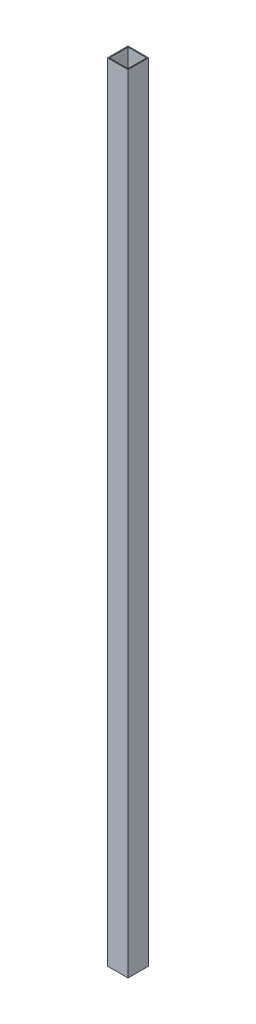
ISO-10303-21;
HEADER;
FILE_DESCRIPTION(('STEP AP214'),'2;1');
FILE_NAME('part.step','',(''),(''),'','','');
FILE_SCHEMA(('AUTOMOTIVE_DESIGN { 1 0 10303 214 1 1 1 1 }'));
ENDSEC;
DATA;
#1=APPLICATION_CONTEXT('core data for automotive mechanical design processes');
#2=APPLICATION_PROTOCOL_DEFINITION('international standard','automotive_design',2000,#1);
#3=PRODUCT_CONTEXT('',#1,'mechanical');
#4=PRODUCT('Part','Part','',(#3));
#5=PRODUCT_RELATED_PRODUCT_CATEGORY('part','',(#4));
#6=PRODUCT_DEFINITION_FORMATION('','',#4);
#7=PRODUCT_DEFINITION_CONTEXT('part definition',#1,'design');
#8=PRODUCT_DEFINITION('design','',#6,#7);
#9=PRODUCT_DEFINITION_SHAPE('','',#8);
#10=(LENGTH_UNIT() NAMED_UNIT(*) SI_UNIT(.MILLI.,.METRE.));
#11=(NAMED_UNIT(*) PLANE_ANGLE_UNIT() SI_UNIT($,.RADIAN.));
#12=(NAMED_UNIT(*) SI_UNIT($,.STERADIAN.) SOLID_ANGLE_UNIT());
#13=UNCERTAINTY_MEASURE_WITH_UNIT(LENGTH_MEASURE(1.E-05),#10,'distance_accuracy_value','');
#14=(GEOMETRIC_REPRESENTATION_CONTEXT(3) GLOBAL_UNCERTAINTY_ASSIGNED_CONTEXT((#13)) GLOBAL_UNIT_ASSIGNED_CONTEXT((#10,
#11,#12)) REPRESENTATION_CONTEXT('',''));
#15=CARTESIAN_POINT('',(0.,0.,0.));
#16=DIRECTION('',(0.,0.,1.));
#17=DIRECTION('',(1.,0.,0.));
#18=AXIS2_PLACEMENT_3D('',#15,#16,#17);
#19=CARTESIAN_POINT('',(0.,1923.,0.));
#20=DIRECTION('',(0.,-1.,0.));
#21=DIRECTION('',(0.,0.,-1.));
#22=AXIS2_PLACEMENT_3D('',#19,#20,#21);
#23=PLANE('',#22);
#24=DIRECTION('',(1.,0.,0.));
#25=VECTOR('',#24,1.);
#26=CARTESIAN_POINT('',(50.,1923.,0.));
#27=LINE('',#26,#25);
#28=CARTESIAN_POINT('',(0.,1923.,0.));
#29=VERTEX_POINT('',#28);
#30=CARTESIAN_POINT('',(50.,1923.,0.));
#31=VERTEX_POINT('',#30);
#32=EDGE_CURVE('E134',#29,#31,#27,.T.);
#33=ORIENTED_EDGE('',*,*,#32,.T.);
#34=DIRECTION('',(0.,0.,-1.));
#35=VECTOR('',#34,1.);
#36=CARTESIAN_POINT('',(50.,1923.,-50.));
#37=LINE('',#36,#35);
#38=CARTESIAN_POINT('',(50.,1923.,-50.));
#39=VERTEX_POINT('',#38);
#40=EDGE_CURVE('E137',#31,#39,#37,.T.);
#41=ORIENTED_EDGE('',*,*,#40,.T.);
#42=DIRECTION('',(-1.,0.,0.));
#43=VECTOR('',#42,1.);
#44=CARTESIAN_POINT('',(0.,1923.,-50.));
#45=LINE('',#44,#43);
#46=CARTESIAN_POINT('',(0.,1923.,-50.));
#47=VERTEX_POINT('',#46);
#48=EDGE_CURVE('E140',#39,#47,#45,.T.);
#49=ORIENTED_EDGE('',*,*,#48,.T.);
#50=DIRECTION('',(0.,0.,1.));
#51=VECTOR('',#50,1.);
#52=CARTESIAN_POINT('',(0.,1923.,0.));
#53=LINE('',#52,#51);
#54=EDGE_CURVE('E142',#47,#29,#53,.T.);
#55=ORIENTED_EDGE('',*,*,#54,.T.);
#56=EDGE_LOOP('',(#33,#41,#49,#55));
#57=FACE_BOUND('',#56,.T.);
#58=DIRECTION('',(0.,0.,1.));
#59=VECTOR('',#58,1.);
#60=CARTESIAN_POINT('',(2.2,1923.,-2.2));
#61=LINE('',#60,#59);
#62=CARTESIAN_POINT('',(2.2,1923.,-47.8));
#63=VERTEX_POINT('',#62);
#64=CARTESIAN_POINT('',(2.2,1923.,-2.2));
#65=VERTEX_POINT('',#64);
#66=EDGE_CURVE('E98',#63,#65,#61,.T.);
#67=ORIENTED_EDGE('',*,*,#66,.F.);
#68=DIRECTION('',(-1.,0.,0.));
#69=VECTOR('',#68,1.);
#70=CARTESIAN_POINT('',(2.2,1923.,-47.8));
#71=LINE('',#70,#69);
#72=CARTESIAN_POINT('',(47.8,1923.,-47.8));
#73=VERTEX_POINT('',#72);
#74=EDGE_CURVE('E120',#73,#63,#71,.T.);
#75=ORIENTED_EDGE('',*,*,#74,.F.);
#76=DIRECTION('',(0.,0.,-1.));
#77=VECTOR('',#76,1.);
#78=CARTESIAN_POINT('',(47.8,1923.,-47.8));
#79=LINE('',#78,#77);
#80=CARTESIAN_POINT('',(47.8,1923.,-2.2));
#81=VERTEX_POINT('',#80);
#82=EDGE_CURVE('E118',#81,#73,#79,.T.);
#83=ORIENTED_EDGE('',*,*,#82,.F.);
#84=DIRECTION('',(1.,0.,0.));
#85=VECTOR('',#84,1.);
#86=CARTESIAN_POINT('',(47.8,1923.,-2.2));
#87=LINE('',#86,#85);
#88=EDGE_CURVE('E106',#65,#81,#87,.T.);
#89=ORIENTED_EDGE('',*,*,#88,.F.);
#90=EDGE_LOOP('',(#67,#75,#83,#89));
#91=FACE_BOUND('',#90,.T.);
#92=ADVANCED_FACE('F33',(#57,#91),#23,.F.);
#93=CARTESIAN_POINT('',(0.,0.,0.));
#94=DIRECTION('',(0.,-1.,0.));
#95=DIRECTION('',(0.,0.,-1.));
#96=AXIS2_PLACEMENT_3D('',#93,#94,#95);
#97=PLANE('',#96);
#98=DIRECTION('',(1.,0.,0.));
#99=VECTOR('',#98,1.);
#100=CARTESIAN_POINT('',(50.,0.,0.));
#101=LINE('',#100,#99);
#102=CARTESIAN_POINT('',(0.,0.,0.));
#103=VERTEX_POINT('',#102);
#104=CARTESIAN_POINT('',(50.,0.,0.));
#105=VERTEX_POINT('',#104);
#106=EDGE_CURVE('E114',#103,#105,#101,.T.);
#107=ORIENTED_EDGE('',*,*,#106,.F.);
#108=DIRECTION('',(0.,0.,1.));
#109=VECTOR('',#108,1.);
#110=CARTESIAN_POINT('',(0.,0.,0.));
#111=LINE('',#110,#109);
#112=CARTESIAN_POINT('',(0.,0.,-50.));
#113=VERTEX_POINT('',#112);
#114=EDGE_CURVE('E138',#113,#103,#111,.T.);
#115=ORIENTED_EDGE('',*,*,#114,.F.);
#116=DIRECTION('',(-1.,0.,0.));
#117=VECTOR('',#116,1.);
#118=CARTESIAN_POINT('',(0.,0.,-50.));
#119=LINE('',#118,#117);
#120=CARTESIAN_POINT('',(50.,0.,-50.));
#121=VERTEX_POINT('',#120);
#122=EDGE_CURVE('E149',#121,#113,#119,.T.);
#123=ORIENTED_EDGE('',*,*,#122,.F.);
#124=DIRECTION('',(0.,0.,-1.));
#125=VECTOR('',#124,1.);
#126=CARTESIAN_POINT('',(50.,0.,-50.));
#127=LINE('',#126,#125);
#128=EDGE_CURVE('E147',#105,#121,#127,.T.);
#129=ORIENTED_EDGE('',*,*,#128,.F.);
#130=EDGE_LOOP('',(#107,#115,#123,#129));
#131=FACE_BOUND('',#130,.T.);
#132=DIRECTION('',(-1.,0.,0.));
#133=VECTOR('',#132,1.);
#134=CARTESIAN_POINT('',(2.2,0.,-47.8));
#135=LINE('',#134,#133);
#136=CARTESIAN_POINT('',(47.8,0.,-47.8));
#137=VERTEX_POINT('',#136);
#138=CARTESIAN_POINT('',(2.2,0.,-47.8));
#139=VERTEX_POINT('',#138);
#140=EDGE_CURVE('E107',#137,#139,#135,.T.);
#141=ORIENTED_EDGE('',*,*,#140,.T.);
#142=DIRECTION('',(0.,0.,1.));
#143=VECTOR('',#142,1.);
#144=CARTESIAN_POINT('',(2.2,0.,-2.2));
#145=LINE('',#144,#143);
#146=CARTESIAN_POINT('',(2.2,0.,-2.2));
#147=VERTEX_POINT('',#146);
#148=EDGE_CURVE('E56',#139,#147,#145,.T.);
#149=ORIENTED_EDGE('',*,*,#148,.T.);
#150=DIRECTION('',(1.,0.,0.));
#151=VECTOR('',#150,1.);
#152=CARTESIAN_POINT('',(47.8,0.,-2.2));
#153=LINE('',#152,#151);
#154=CARTESIAN_POINT('',(47.8,0.,-2.2));
#155=VERTEX_POINT('',#154);
#156=EDGE_CURVE('E113',#147,#155,#153,.T.);
#157=ORIENTED_EDGE('',*,*,#156,.T.);
#158=DIRECTION('',(0.,0.,-1.));
#159=VECTOR('',#158,1.);
#160=CARTESIAN_POINT('',(47.8,0.,-47.8));
#161=LINE('',#160,#159);
#162=EDGE_CURVE('E126',#155,#137,#161,.T.);
#163=ORIENTED_EDGE('',*,*,#162,.T.);
#164=EDGE_LOOP('',(#141,#149,#157,#163));
#165=FACE_BOUND('',#164,.T.);
#166=ADVANCED_FACE('F167',(#131,#165),#97,.T.);
#167=CARTESIAN_POINT('',(50.,1923.,0.));
#168=DIRECTION('',(0.,0.,-1.));
#169=DIRECTION('',(-1.,0.,0.));
#170=AXIS2_PLACEMENT_3D('',#167,#168,#169);
#171=PLANE('',#170);
#172=ORIENTED_EDGE('',*,*,#106,.T.);
#173=DIRECTION('',(0.,-1.,0.));
#174=VECTOR('',#173,1.);
#175=CARTESIAN_POINT('',(50.,1923.,0.));
#176=LINE('',#175,#174);
#177=EDGE_CURVE('E11',#31,#105,#176,.T.);
#178=ORIENTED_EDGE('',*,*,#177,.F.);
#179=ORIENTED_EDGE('',*,*,#32,.F.);
#180=DIRECTION('',(0.,-1.,0.));
#181=VECTOR('',#180,1.);
#182=CARTESIAN_POINT('',(0.,1923.,0.));
#183=LINE('',#182,#181);
#184=EDGE_CURVE('E144',#29,#103,#183,.T.);
#185=ORIENTED_EDGE('',*,*,#184,.T.);
#186=EDGE_LOOP('',(#172,#178,#179,#185));
#187=FACE_BOUND('',#186,.T.);
#188=ADVANCED_FACE('F35',(#187),#171,.F.);
#189=CARTESIAN_POINT('',(50.,1923.,-50.));
#190=DIRECTION('',(-1.,0.,0.));
#191=DIRECTION('',(0.,0.,1.));
#192=AXIS2_PLACEMENT_3D('',#189,#190,#191);
#193=PLANE('',#192);
#194=ORIENTED_EDGE('',*,*,#128,.T.);
#195=DIRECTION('',(0.,-1.,0.));
#196=VECTOR('',#195,1.);
#197=CARTESIAN_POINT('',(50.,1923.,-50.));
#198=LINE('',#197,#196);
#199=EDGE_CURVE('E41',#39,#121,#198,.T.);
#200=ORIENTED_EDGE('',*,*,#199,.F.);
#201=ORIENTED_EDGE('',*,*,#40,.F.);
#202=ORIENTED_EDGE('',*,*,#177,.T.);
#203=EDGE_LOOP('',(#194,#200,#201,#202));
#204=FACE_BOUND('',#203,.T.);
#205=ADVANCED_FACE('F177',(#204),#193,.F.);
#206=CARTESIAN_POINT('',(0.,1923.,-50.));
#207=DIRECTION('',(0.,0.,1.));
#208=DIRECTION('',(1.,0.,0.));
#209=AXIS2_PLACEMENT_3D('',#206,#207,#208);
#210=PLANE('',#209);
#211=ORIENTED_EDGE('',*,*,#122,.T.);
#212=DIRECTION('',(0.,-1.,0.));
#213=VECTOR('',#212,1.);
#214=CARTESIAN_POINT('',(0.,1923.,-50.));
#215=LINE('',#214,#213);
#216=EDGE_CURVE('E154',#47,#113,#215,.T.);
#217=ORIENTED_EDGE('',*,*,#216,.F.);
#218=ORIENTED_EDGE('',*,*,#48,.F.);
#219=ORIENTED_EDGE('',*,*,#199,.T.);
#220=EDGE_LOOP('',(#211,#217,#218,#219));
#221=FACE_BOUND('',#220,.T.);
#222=ADVANCED_FACE('F161',(#221),#210,.F.);
#223=CARTESIAN_POINT('',(0.,1923.,0.));
#224=DIRECTION('',(1.,0.,0.));
#225=DIRECTION('',(0.,0.,-1.));
#226=AXIS2_PLACEMENT_3D('',#223,#224,#225);
#227=PLANE('',#226);
#228=ORIENTED_EDGE('',*,*,#114,.T.);
#229=ORIENTED_EDGE('',*,*,#184,.F.);
#230=ORIENTED_EDGE('',*,*,#54,.F.);
#231=ORIENTED_EDGE('',*,*,#216,.T.);
#232=EDGE_LOOP('',(#228,#229,#230,#231));
#233=FACE_BOUND('',#232,.T.);
#234=ADVANCED_FACE('F171',(#233),#227,.F.);
#235=CARTESIAN_POINT('',(2.2,1923.,-2.2));
#236=DIRECTION('',(1.,0.,0.));
#237=DIRECTION('',(0.,0.,-1.));
#238=AXIS2_PLACEMENT_3D('',#235,#236,#237);
#239=PLANE('',#238);
#240=ORIENTED_EDGE('',*,*,#148,.F.);
#241=DIRECTION('',(0.,-1.,0.));
#242=VECTOR('',#241,1.);
#243=CARTESIAN_POINT('',(2.2,1923.,-47.8));
#244=LINE('',#243,#242);
#245=EDGE_CURVE('E102',#63,#139,#244,.T.);
#246=ORIENTED_EDGE('',*,*,#245,.F.);
#247=ORIENTED_EDGE('',*,*,#66,.T.);
#248=DIRECTION('',(0.,-1.,0.));
#249=VECTOR('',#248,1.);
#250=CARTESIAN_POINT('',(2.2,1923.,-2.2));
#251=LINE('',#250,#249);
#252=EDGE_CURVE('E101',#65,#147,#251,.T.);
#253=ORIENTED_EDGE('',*,*,#252,.T.);
#254=EDGE_LOOP('',(#240,#246,#247,#253));
#255=FACE_BOUND('',#254,.T.);
#256=ADVANCED_FACE('F100',(#255),#239,.T.);
#257=CARTESIAN_POINT('',(47.8,1923.,-2.2));
#258=DIRECTION('',(0.,0.,-1.));
#259=DIRECTION('',(-1.,0.,0.));
#260=AXIS2_PLACEMENT_3D('',#257,#258,#259);
#261=PLANE('',#260);
#262=ORIENTED_EDGE('',*,*,#156,.F.);
#263=ORIENTED_EDGE('',*,*,#252,.F.);
#264=ORIENTED_EDGE('',*,*,#88,.T.);
#265=DIRECTION('',(0.,-1.,0.));
#266=VECTOR('',#265,1.);
#267=CARTESIAN_POINT('',(47.8,1923.,-2.2));
#268=LINE('',#267,#266);
#269=EDGE_CURVE('E115',#81,#155,#268,.T.);
#270=ORIENTED_EDGE('',*,*,#269,.T.);
#271=EDGE_LOOP('',(#262,#263,#264,#270));
#272=FACE_BOUND('',#271,.T.);
#273=ADVANCED_FACE('F110',(#272),#261,.T.);
#274=CARTESIAN_POINT('',(47.8,1923.,-47.8));
#275=DIRECTION('',(-1.,0.,0.));
#276=DIRECTION('',(0.,0.,1.));
#277=AXIS2_PLACEMENT_3D('',#274,#275,#276);
#278=PLANE('',#277);
#279=ORIENTED_EDGE('',*,*,#162,.F.);
#280=ORIENTED_EDGE('',*,*,#269,.F.);
#281=ORIENTED_EDGE('',*,*,#82,.T.);
#282=DIRECTION('',(0.,-1.,0.));
#283=VECTOR('',#282,1.);
#284=CARTESIAN_POINT('',(47.8,1923.,-47.8));
#285=LINE('',#284,#283);
#286=EDGE_CURVE('E48',#73,#137,#285,.T.);
#287=ORIENTED_EDGE('',*,*,#286,.T.);
#288=EDGE_LOOP('',(#279,#280,#281,#287));
#289=FACE_BOUND('',#288,.T.);
#290=ADVANCED_FACE('F200',(#289),#278,.T.);
#291=CARTESIAN_POINT('',(2.2,1923.,-47.8));
#292=DIRECTION('',(0.,0.,1.));
#293=DIRECTION('',(1.,0.,0.));
#294=AXIS2_PLACEMENT_3D('',#291,#292,#293);
#295=PLANE('',#294);
#296=ORIENTED_EDGE('',*,*,#140,.F.);
#297=ORIENTED_EDGE('',*,*,#286,.F.);
#298=ORIENTED_EDGE('',*,*,#74,.T.);
#299=ORIENTED_EDGE('',*,*,#245,.T.);
#300=EDGE_LOOP('',(#296,#297,#298,#299));
#301=FACE_BOUND('',#300,.T.);
#302=ADVANCED_FACE('F204',(#301),#295,.T.);
#303=CLOSED_SHELL('',(#92,#166,#188,#205,#222,#234,#256,#273,#290,#302));
#304=MANIFOLD_SOLID_BREP('B2',#303);
#305=ADVANCED_BREP_SHAPE_REPRESENTATION('',(#18,#304),#14);
#306=SHAPE_DEFINITION_REPRESENTATION(#9,#305);
ENDSEC;
END-ISO-10303-21;
